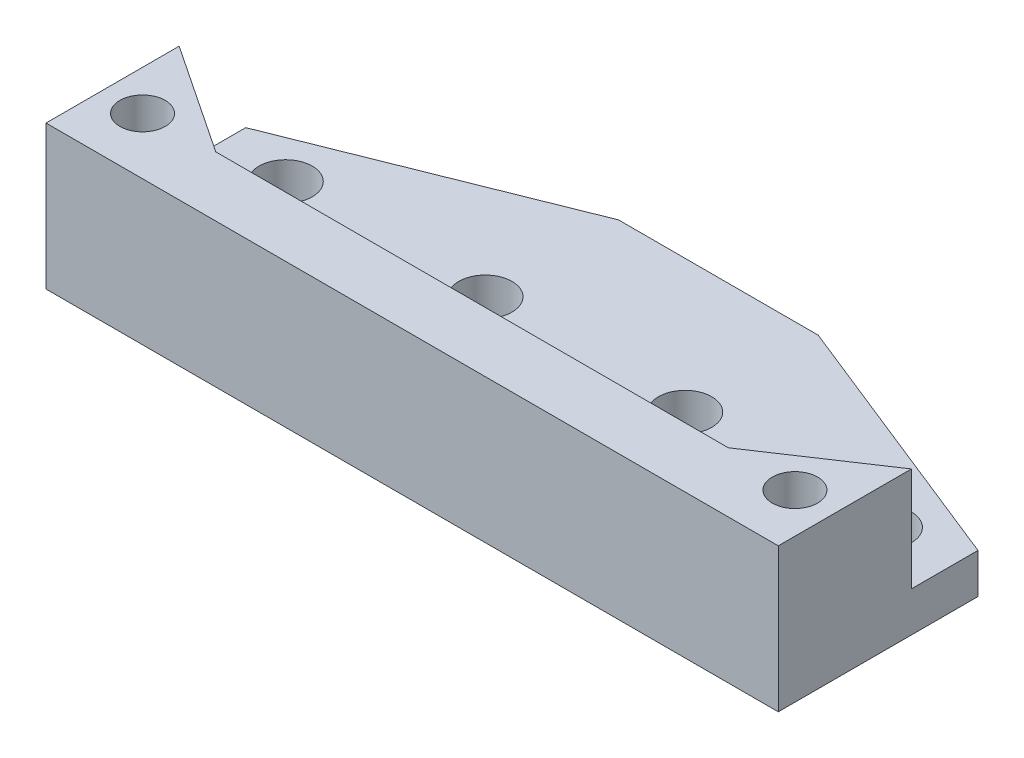
ISO-10303-21;
HEADER;
FILE_DESCRIPTION(('STEP AP214'),'2;1');
FILE_NAME('part.step','',(''),(''),'','','');
FILE_SCHEMA(('AUTOMOTIVE_DESIGN { 1 0 10303 214 1 1 1 1 }'));
ENDSEC;
DATA;
#1=APPLICATION_CONTEXT('core data for automotive mechanical design processes');
#2=APPLICATION_PROTOCOL_DEFINITION('international standard','automotive_design',2000,#1);
#3=PRODUCT_CONTEXT('',#1,'mechanical');
#4=PRODUCT('Part','Part','',(#3));
#5=PRODUCT_RELATED_PRODUCT_CATEGORY('part','',(#4));
#6=PRODUCT_DEFINITION_FORMATION('','',#4);
#7=PRODUCT_DEFINITION_CONTEXT('part definition',#1,'design');
#8=PRODUCT_DEFINITION('design','',#6,#7);
#9=PRODUCT_DEFINITION_SHAPE('','',#8);
#10=(LENGTH_UNIT() NAMED_UNIT(*) SI_UNIT(.MILLI.,.METRE.));
#11=(NAMED_UNIT(*) PLANE_ANGLE_UNIT() SI_UNIT($,.RADIAN.));
#12=(NAMED_UNIT(*) SI_UNIT($,.STERADIAN.) SOLID_ANGLE_UNIT());
#13=UNCERTAINTY_MEASURE_WITH_UNIT(LENGTH_MEASURE(1.E-05),#10,'distance_accuracy_value','');
#14=(GEOMETRIC_REPRESENTATION_CONTEXT(3) GLOBAL_UNCERTAINTY_ASSIGNED_CONTEXT((#13)) GLOBAL_UNIT_ASSIGNED_CONTEXT((#10,
#11,#12)) REPRESENTATION_CONTEXT('',''));
#15=CARTESIAN_POINT('',(0.,0.,0.));
#16=DIRECTION('',(0.,0.,1.));
#17=DIRECTION('',(1.,0.,0.));
#18=AXIS2_PLACEMENT_3D('',#15,#16,#17);
#19=CARTESIAN_POINT('',(0.,3.,0.));
#20=DIRECTION('',(0.,-1.,0.));
#21=DIRECTION('',(0.,0.,-1.));
#22=AXIS2_PLACEMENT_3D('',#19,#20,#21);
#23=PLANE('',#22);
#24=DIRECTION('',(0.,0.,1.));
#25=VECTOR('',#24,1.);
#26=CARTESIAN_POINT('',(0.,3.,0.));
#27=LINE('',#26,#25);
#28=CARTESIAN_POINT('',(0.,3.,-15.));
#29=VERTEX_POINT('',#28);
#30=CARTESIAN_POINT('',(0.,3.,-10.));
#31=VERTEX_POINT('',#30);
#32=EDGE_CURVE('E59',#29,#31,#27,.T.);
#33=ORIENTED_EDGE('',*,*,#32,.T.);
#34=DIRECTION('',(0.832050294337844,0.,0.554700196225229));
#35=VECTOR('',#34,1.);
#36=CARTESIAN_POINT('',(4.61538461538462,3.,-6.92307692307692));
#37=LINE('',#36,#35);
#38=CARTESIAN_POINT('',(8.25000000000001,3.,-4.49999999999999));
#39=VERTEX_POINT('',#38);
#40=EDGE_CURVE('E54',#31,#39,#37,.T.);
#41=ORIENTED_EDGE('',*,*,#40,.T.);
#42=DIRECTION('',(-1.,0.,0.));
#43=VECTOR('',#42,1.);
#44=CARTESIAN_POINT('',(0.,3.,-4.49999999999999));
#45=LINE('',#44,#43);
#46=CARTESIAN_POINT('',(46.75,3.,-4.50000000000001));
#47=VERTEX_POINT('',#46);
#48=EDGE_CURVE('E137',#47,#39,#45,.T.);
#49=ORIENTED_EDGE('',*,*,#48,.F.);
#50=DIRECTION('',(-0.832050294337844,0.,0.554700196225229));
#51=VECTOR('',#50,1.);
#52=CARTESIAN_POINT('',(12.3076923076923,3.,18.4615384615385));
#53=LINE('',#52,#51);
#54=CARTESIAN_POINT('',(55.,3.,-10.));
#55=VERTEX_POINT('',#54);
#56=EDGE_CURVE('E140',#55,#47,#53,.T.);
#57=ORIENTED_EDGE('',*,*,#56,.F.);
#58=DIRECTION('',(0.,0.,-1.));
#59=VECTOR('',#58,1.);
#60=CARTESIAN_POINT('',(55.,3.,-15.));
#61=LINE('',#60,#59);
#62=CARTESIAN_POINT('',(55.,3.,-15.));
#63=VERTEX_POINT('',#62);
#64=EDGE_CURVE('E187',#55,#63,#61,.T.);
#65=ORIENTED_EDGE('',*,*,#64,.T.);
#66=DIRECTION('',(-0.928476690885259,0.,-0.371390676354104));
#67=VECTOR('',#66,1.);
#68=CARTESIAN_POINT('',(35.,3.,-23.));
#69=LINE('',#68,#67);
#70=CARTESIAN_POINT('',(35.,3.,-23.));
#71=VERTEX_POINT('',#70);
#72=EDGE_CURVE('E189',#63,#71,#69,.T.);
#73=ORIENTED_EDGE('',*,*,#72,.T.);
#74=DIRECTION('',(-1.,0.,0.));
#75=VECTOR('',#74,1.);
#76=CARTESIAN_POINT('',(20.,3.,-23.));
#77=LINE('',#76,#75);
#78=CARTESIAN_POINT('',(20.,3.,-23.));
#79=VERTEX_POINT('',#78);
#80=EDGE_CURVE('E192',#71,#79,#77,.T.);
#81=ORIENTED_EDGE('',*,*,#80,.T.);
#82=DIRECTION('',(-0.928476690885259,0.,0.371390676354104));
#83=VECTOR('',#82,1.);
#84=CARTESIAN_POINT('',(0.,3.,-15.));
#85=LINE('',#84,#83);
#86=EDGE_CURVE('E194',#79,#29,#85,.T.);
#87=ORIENTED_EDGE('',*,*,#86,.T.);
#88=EDGE_LOOP('',(#33,#41,#49,#57,#65,#73,#81,#87));
#89=FACE_BOUND('',#88,.T.);
#90=CARTESIAN_POINT('',(5.,3.,-13.));
#91=DIRECTION('',(0.,1.,0.));
#92=DIRECTION('',(0.,0.,1.));
#93=AXIS2_PLACEMENT_3D('',#90,#91,#92);
#94=CIRCLE('',#93,2.);
#95=CARTESIAN_POINT('',(5.,3.,-11.));
#96=VERTEX_POINT('',#95);
#97=EDGE_CURVE('E181',#96,#96,#94,.T.);
#98=ORIENTED_EDGE('',*,*,#97,.F.);
#99=EDGE_LOOP('',(#98));
#100=FACE_BOUND('',#99,.T.);
#101=CARTESIAN_POINT('',(20.,3.,-13.));
#102=DIRECTION('',(0.,1.,0.));
#103=DIRECTION('',(0.,0.,1.));
#104=AXIS2_PLACEMENT_3D('',#101,#102,#103);
#105=CIRCLE('',#104,2.);
#106=CARTESIAN_POINT('',(20.,3.,-11.));
#107=VERTEX_POINT('',#106);
#108=EDGE_CURVE('E175',#107,#107,#105,.T.);
#109=ORIENTED_EDGE('',*,*,#108,.F.);
#110=EDGE_LOOP('',(#109));
#111=FACE_BOUND('',#110,.T.);
#112=CARTESIAN_POINT('',(35.,3.,-13.));
#113=DIRECTION('',(0.,1.,0.));
#114=DIRECTION('',(0.,0.,1.));
#115=AXIS2_PLACEMENT_3D('',#112,#113,#114);
#116=CIRCLE('',#115,2.);
#117=CARTESIAN_POINT('',(35.,3.,-11.));
#118=VERTEX_POINT('',#117);
#119=EDGE_CURVE('E169',#118,#118,#116,.T.);
#120=ORIENTED_EDGE('',*,*,#119,.F.);
#121=EDGE_LOOP('',(#120));
#122=FACE_BOUND('',#121,.T.);
#123=CARTESIAN_POINT('',(50.,3.,-13.));
#124=DIRECTION('',(0.,1.,0.));
#125=DIRECTION('',(0.,0.,1.));
#126=AXIS2_PLACEMENT_3D('',#123,#124,#125);
#127=CIRCLE('',#126,2.);
#128=CARTESIAN_POINT('',(50.,3.,-11.));
#129=VERTEX_POINT('',#128);
#130=EDGE_CURVE('E163',#129,#129,#127,.T.);
#131=ORIENTED_EDGE('',*,*,#130,.F.);
#132=EDGE_LOOP('',(#131));
#133=FACE_BOUND('',#132,.T.);
#134=ADVANCED_FACE('F39',(#89,#100,#111,#122,#133),#23,.F.);
#135=CARTESIAN_POINT('',(0.,0.,0.));
#136=DIRECTION('',(0.,-1.,0.));
#137=DIRECTION('',(0.,0.,-1.));
#138=AXIS2_PLACEMENT_3D('',#135,#136,#137);
#139=PLANE('',#138);
#140=CARTESIAN_POINT('',(3.,0.,-4.25));
#141=DIRECTION('',(0.,1.,0.));
#142=DIRECTION('',(0.,0.,1.));
#143=AXIS2_PLACEMENT_3D('',#140,#141,#142);
#144=CIRCLE('',#143,1.7);
#145=CARTESIAN_POINT('',(3.,0.,-2.55));
#146=VERTEX_POINT('',#145);
#147=EDGE_CURVE('E154',#146,#146,#144,.T.);
#148=ORIENTED_EDGE('',*,*,#147,.T.);
#149=EDGE_LOOP('',(#148));
#150=FACE_BOUND('',#149,.T.);
#151=CARTESIAN_POINT('',(52.,0.,-4.25));
#152=DIRECTION('',(0.,1.,0.));
#153=DIRECTION('',(0.,0.,1.));
#154=AXIS2_PLACEMENT_3D('',#151,#152,#153);
#155=CIRCLE('',#154,1.7);
#156=CARTESIAN_POINT('',(52.,0.,-2.55));
#157=VERTEX_POINT('',#156);
#158=EDGE_CURVE('E143',#157,#157,#155,.T.);
#159=ORIENTED_EDGE('',*,*,#158,.T.);
#160=EDGE_LOOP('',(#159));
#161=FACE_BOUND('',#160,.T.);
#162=CARTESIAN_POINT('',(35.,0.,-13.));
#163=DIRECTION('',(0.,1.,0.));
#164=DIRECTION('',(0.,0.,1.));
#165=AXIS2_PLACEMENT_3D('',#162,#163,#164);
#166=CIRCLE('',#165,2.);
#167=CARTESIAN_POINT('',(35.,0.,-11.));
#168=VERTEX_POINT('',#167);
#169=EDGE_CURVE('E166',#168,#168,#166,.T.);
#170=ORIENTED_EDGE('',*,*,#169,.T.);
#171=EDGE_LOOP('',(#170));
#172=FACE_BOUND('',#171,.T.);
#173=CARTESIAN_POINT('',(5.,0.,-13.));
#174=DIRECTION('',(0.,1.,0.));
#175=DIRECTION('',(0.,0.,1.));
#176=AXIS2_PLACEMENT_3D('',#173,#174,#175);
#177=CIRCLE('',#176,2.);
#178=CARTESIAN_POINT('',(5.,0.,-11.));
#179=VERTEX_POINT('',#178);
#180=EDGE_CURVE('E178',#179,#179,#177,.T.);
#181=ORIENTED_EDGE('',*,*,#180,.T.);
#182=EDGE_LOOP('',(#181));
#183=FACE_BOUND('',#182,.T.);
#184=DIRECTION('',(1.,0.,0.));
#185=VECTOR('',#184,1.);
#186=CARTESIAN_POINT('',(55.,0.,0.));
#187=LINE('',#186,#185);
#188=CARTESIAN_POINT('',(0.,0.,0.));
#189=VERTEX_POINT('',#188);
#190=CARTESIAN_POINT('',(55.,0.,0.));
#191=VERTEX_POINT('',#190);
#192=EDGE_CURVE('E184',#189,#191,#187,.T.);
#193=ORIENTED_EDGE('',*,*,#192,.F.);
#194=DIRECTION('',(0.,0.,1.));
#195=VECTOR('',#194,1.);
#196=CARTESIAN_POINT('',(0.,0.,0.));
#197=LINE('',#196,#195);
#198=CARTESIAN_POINT('',(0.,0.,-15.));
#199=VERTEX_POINT('',#198);
#200=EDGE_CURVE('E190',#199,#189,#197,.T.);
#201=ORIENTED_EDGE('',*,*,#200,.F.);
#202=DIRECTION('',(-0.928476690885259,0.,0.371390676354104));
#203=VECTOR('',#202,1.);
#204=CARTESIAN_POINT('',(0.,0.,-15.));
#205=LINE('',#204,#203);
#206=CARTESIAN_POINT('',(20.,0.,-23.));
#207=VERTEX_POINT('',#206);
#208=EDGE_CURVE('E205',#207,#199,#205,.T.);
#209=ORIENTED_EDGE('',*,*,#208,.F.);
#210=DIRECTION('',(-1.,0.,0.));
#211=VECTOR('',#210,1.);
#212=CARTESIAN_POINT('',(20.,0.,-23.));
#213=LINE('',#212,#211);
#214=CARTESIAN_POINT('',(35.,0.,-23.));
#215=VERTEX_POINT('',#214);
#216=EDGE_CURVE('E203',#215,#207,#213,.T.);
#217=ORIENTED_EDGE('',*,*,#216,.F.);
#218=DIRECTION('',(-0.928476690885259,0.,-0.371390676354104));
#219=VECTOR('',#218,1.);
#220=CARTESIAN_POINT('',(35.,0.,-23.));
#221=LINE('',#220,#219);
#222=CARTESIAN_POINT('',(55.,0.,-15.));
#223=VERTEX_POINT('',#222);
#224=EDGE_CURVE('E201',#223,#215,#221,.T.);
#225=ORIENTED_EDGE('',*,*,#224,.F.);
#226=DIRECTION('',(0.,0.,-1.));
#227=VECTOR('',#226,1.);
#228=CARTESIAN_POINT('',(55.,0.,-15.));
#229=LINE('',#228,#227);
#230=EDGE_CURVE('E199',#191,#223,#229,.T.);
#231=ORIENTED_EDGE('',*,*,#230,.F.);
#232=EDGE_LOOP('',(#193,#201,#209,#217,#225,#231));
#233=FACE_BOUND('',#232,.T.);
#234=CARTESIAN_POINT('',(20.,0.,-13.));
#235=DIRECTION('',(0.,1.,0.));
#236=DIRECTION('',(0.,0.,1.));
#237=AXIS2_PLACEMENT_3D('',#234,#235,#236);
#238=CIRCLE('',#237,2.);
#239=CARTESIAN_POINT('',(20.,0.,-11.));
#240=VERTEX_POINT('',#239);
#241=EDGE_CURVE('E172',#240,#240,#238,.T.);
#242=ORIENTED_EDGE('',*,*,#241,.T.);
#243=EDGE_LOOP('',(#242));
#244=FACE_BOUND('',#243,.T.);
#245=CARTESIAN_POINT('',(50.,0.,-13.));
#246=DIRECTION('',(0.,1.,0.));
#247=DIRECTION('',(0.,0.,1.));
#248=AXIS2_PLACEMENT_3D('',#245,#246,#247);
#249=CIRCLE('',#248,2.);
#250=CARTESIAN_POINT('',(50.,0.,-11.));
#251=VERTEX_POINT('',#250);
#252=EDGE_CURVE('E120',#251,#251,#249,.T.);
#253=ORIENTED_EDGE('',*,*,#252,.T.);
#254=EDGE_LOOP('',(#253));
#255=FACE_BOUND('',#254,.T.);
#256=ADVANCED_FACE('F229',(#150,#161,#172,#183,#233,#244,#255),#139,.T.);
#257=CARTESIAN_POINT('',(55.,3.,0.));
#258=DIRECTION('',(0.,0.,-1.));
#259=DIRECTION('',(-1.,0.,0.));
#260=AXIS2_PLACEMENT_3D('',#257,#258,#259);
#261=PLANE('',#260);
#262=ORIENTED_EDGE('',*,*,#192,.T.);
#263=DIRECTION('',(0.,-1.,0.));
#264=VECTOR('',#263,1.);
#265=CARTESIAN_POINT('',(55.,3.,0.));
#266=LINE('',#265,#264);
#267=CARTESIAN_POINT('',(55.,10.8,0.));
#268=VERTEX_POINT('',#267);
#269=EDGE_CURVE('E11',#268,#191,#266,.T.);
#270=ORIENTED_EDGE('',*,*,#269,.F.);
#271=DIRECTION('',(1.,0.,0.));
#272=VECTOR('',#271,1.);
#273=CARTESIAN_POINT('',(0.,10.8,0.));
#274=LINE('',#273,#272);
#275=CARTESIAN_POINT('',(0.,10.8,0.));
#276=VERTEX_POINT('',#275);
#277=EDGE_CURVE('E131',#276,#268,#274,.T.);
#278=ORIENTED_EDGE('',*,*,#277,.F.);
#279=DIRECTION('',(0.,-1.,0.));
#280=VECTOR('',#279,1.);
#281=CARTESIAN_POINT('',(0.,3.,0.));
#282=LINE('',#281,#280);
#283=EDGE_CURVE('E127',#276,#189,#282,.T.);
#284=ORIENTED_EDGE('',*,*,#283,.T.);
#285=EDGE_LOOP('',(#262,#270,#278,#284));
#286=FACE_BOUND('',#285,.T.);
#287=ADVANCED_FACE('F41',(#286),#261,.F.);
#288=CARTESIAN_POINT('',(55.,3.,-15.));
#289=DIRECTION('',(-1.,0.,0.));
#290=DIRECTION('',(0.,0.,1.));
#291=AXIS2_PLACEMENT_3D('',#288,#289,#290);
#292=PLANE('',#291);
#293=ORIENTED_EDGE('',*,*,#230,.T.);
#294=DIRECTION('',(0.,-1.,0.));
#295=VECTOR('',#294,1.);
#296=CARTESIAN_POINT('',(55.,3.,-15.));
#297=LINE('',#296,#295);
#298=EDGE_CURVE('E47',#63,#223,#297,.T.);
#299=ORIENTED_EDGE('',*,*,#298,.F.);
#300=ORIENTED_EDGE('',*,*,#64,.F.);
#301=DIRECTION('',(0.,-1.,0.));
#302=VECTOR('',#301,1.);
#303=CARTESIAN_POINT('',(55.,10.8,-10.));
#304=LINE('',#303,#302);
#305=CARTESIAN_POINT('',(55.,10.8,-10.));
#306=VERTEX_POINT('',#305);
#307=EDGE_CURVE('E121',#306,#55,#304,.T.);
#308=ORIENTED_EDGE('',*,*,#307,.F.);
#309=DIRECTION('',(0.,0.,-1.));
#310=VECTOR('',#309,1.);
#311=CARTESIAN_POINT('',(55.,10.8,0.));
#312=LINE('',#311,#310);
#313=EDGE_CURVE('E147',#268,#306,#312,.T.);
#314=ORIENTED_EDGE('',*,*,#313,.F.);
#315=ORIENTED_EDGE('',*,*,#269,.T.);
#316=EDGE_LOOP('',(#293,#299,#300,#308,#314,#315));
#317=FACE_BOUND('',#316,.T.);
#318=ADVANCED_FACE('F243',(#317),#292,.F.);
#319=CARTESIAN_POINT('',(35.,3.,-23.));
#320=DIRECTION('',(-0.371390676354104,0.,0.928476690885259));
#321=DIRECTION('',(0.928476690885259,0.,0.371390676354104));
#322=AXIS2_PLACEMENT_3D('',#319,#320,#321);
#323=PLANE('',#322);
#324=ORIENTED_EDGE('',*,*,#224,.T.);
#325=DIRECTION('',(0.,-1.,0.));
#326=VECTOR('',#325,1.);
#327=CARTESIAN_POINT('',(35.,3.,-23.));
#328=LINE('',#327,#326);
#329=EDGE_CURVE('E215',#71,#215,#328,.T.);
#330=ORIENTED_EDGE('',*,*,#329,.F.);
#331=ORIENTED_EDGE('',*,*,#72,.F.);
#332=ORIENTED_EDGE('',*,*,#298,.T.);
#333=EDGE_LOOP('',(#324,#330,#331,#332));
#334=FACE_BOUND('',#333,.T.);
#335=ADVANCED_FACE('F222',(#334),#323,.F.);
#336=CARTESIAN_POINT('',(20.,3.,-23.));
#337=DIRECTION('',(0.,0.,1.));
#338=DIRECTION('',(1.,0.,0.));
#339=AXIS2_PLACEMENT_3D('',#336,#337,#338);
#340=PLANE('',#339);
#341=ORIENTED_EDGE('',*,*,#216,.T.);
#342=DIRECTION('',(0.,-1.,0.));
#343=VECTOR('',#342,1.);
#344=CARTESIAN_POINT('',(20.,3.,-23.));
#345=LINE('',#344,#343);
#346=EDGE_CURVE('E212',#79,#207,#345,.T.);
#347=ORIENTED_EDGE('',*,*,#346,.F.);
#348=ORIENTED_EDGE('',*,*,#80,.F.);
#349=ORIENTED_EDGE('',*,*,#329,.T.);
#350=EDGE_LOOP('',(#341,#347,#348,#349));
#351=FACE_BOUND('',#350,.T.);
#352=ADVANCED_FACE('F235',(#351),#340,.F.);
#353=CARTESIAN_POINT('',(0.,3.,-15.));
#354=DIRECTION('',(0.371390676354104,0.,0.928476690885259));
#355=DIRECTION('',(0.928476690885259,0.,-0.371390676354104));
#356=AXIS2_PLACEMENT_3D('',#353,#354,#355);
#357=PLANE('',#356);
#358=ORIENTED_EDGE('',*,*,#208,.T.);
#359=DIRECTION('',(0.,-1.,0.));
#360=VECTOR('',#359,1.);
#361=CARTESIAN_POINT('',(0.,3.,-15.));
#362=LINE('',#361,#360);
#363=EDGE_CURVE('E209',#29,#199,#362,.T.);
#364=ORIENTED_EDGE('',*,*,#363,.F.);
#365=ORIENTED_EDGE('',*,*,#86,.F.);
#366=ORIENTED_EDGE('',*,*,#346,.T.);
#367=EDGE_LOOP('',(#358,#364,#365,#366));
#368=FACE_BOUND('',#367,.T.);
#369=ADVANCED_FACE('F239',(#368),#357,.F.);
#370=CARTESIAN_POINT('',(0.,3.,0.));
#371=DIRECTION('',(1.,0.,0.));
#372=DIRECTION('',(0.,0.,-1.));
#373=AXIS2_PLACEMENT_3D('',#370,#371,#372);
#374=PLANE('',#373);
#375=ORIENTED_EDGE('',*,*,#200,.T.);
#376=ORIENTED_EDGE('',*,*,#283,.F.);
#377=DIRECTION('',(0.,0.,1.));
#378=VECTOR('',#377,1.);
#379=CARTESIAN_POINT('',(0.,10.8,0.));
#380=LINE('',#379,#378);
#381=CARTESIAN_POINT('',(0.,10.8,-10.));
#382=VERTEX_POINT('',#381);
#383=EDGE_CURVE('E124',#382,#276,#380,.T.);
#384=ORIENTED_EDGE('',*,*,#383,.F.);
#385=DIRECTION('',(0.,-1.,0.));
#386=VECTOR('',#385,1.);
#387=CARTESIAN_POINT('',(0.,10.8,-10.));
#388=LINE('',#387,#386);
#389=EDGE_CURVE('E114',#382,#31,#388,.T.);
#390=ORIENTED_EDGE('',*,*,#389,.T.);
#391=ORIENTED_EDGE('',*,*,#32,.F.);
#392=ORIENTED_EDGE('',*,*,#363,.T.);
#393=EDGE_LOOP('',(#375,#376,#384,#390,#391,#392));
#394=FACE_BOUND('',#393,.T.);
#395=ADVANCED_FACE('F125',(#394),#374,.F.);
#396=CARTESIAN_POINT('',(5.,3.,-13.));
#397=DIRECTION('',(0.,-1.,0.));
#398=DIRECTION('',(0.,0.,-1.));
#399=AXIS2_PLACEMENT_3D('',#396,#397,#398);
#400=CYLINDRICAL_SURFACE('',#399,2.);
#401=ORIENTED_EDGE('',*,*,#97,.T.);
#402=EDGE_LOOP('',(#401));
#403=FACE_BOUND('',#402,.T.);
#404=ORIENTED_EDGE('',*,*,#180,.F.);
#405=EDGE_LOOP('',(#404));
#406=FACE_BOUND('',#405,.T.);
#407=ADVANCED_FACE('F264',(#403,#406),#400,.F.);
#408=CARTESIAN_POINT('',(20.,3.,-13.));
#409=DIRECTION('',(0.,-1.,0.));
#410=DIRECTION('',(0.,0.,-1.));
#411=AXIS2_PLACEMENT_3D('',#408,#409,#410);
#412=CYLINDRICAL_SURFACE('',#411,2.);
#413=ORIENTED_EDGE('',*,*,#108,.T.);
#414=EDGE_LOOP('',(#413));
#415=FACE_BOUND('',#414,.T.);
#416=ORIENTED_EDGE('',*,*,#241,.F.);
#417=EDGE_LOOP('',(#416));
#418=FACE_BOUND('',#417,.T.);
#419=ADVANCED_FACE('F293',(#415,#418),#412,.F.);
#420=CARTESIAN_POINT('',(35.,3.,-13.));
#421=DIRECTION('',(0.,-1.,0.));
#422=DIRECTION('',(0.,0.,-1.));
#423=AXIS2_PLACEMENT_3D('',#420,#421,#422);
#424=CYLINDRICAL_SURFACE('',#423,2.);
#425=ORIENTED_EDGE('',*,*,#119,.T.);
#426=EDGE_LOOP('',(#425));
#427=FACE_BOUND('',#426,.T.);
#428=ORIENTED_EDGE('',*,*,#169,.F.);
#429=EDGE_LOOP('',(#428));
#430=FACE_BOUND('',#429,.T.);
#431=ADVANCED_FACE('F300',(#427,#430),#424,.F.);
#432=CARTESIAN_POINT('',(50.,3.,-13.));
#433=DIRECTION('',(0.,-1.,0.));
#434=DIRECTION('',(0.,0.,-1.));
#435=AXIS2_PLACEMENT_3D('',#432,#433,#434);
#436=CYLINDRICAL_SURFACE('',#435,2.);
#437=ORIENTED_EDGE('',*,*,#130,.T.);
#438=EDGE_LOOP('',(#437));
#439=FACE_BOUND('',#438,.T.);
#440=ORIENTED_EDGE('',*,*,#252,.F.);
#441=EDGE_LOOP('',(#440));
#442=FACE_BOUND('',#441,.T.);
#443=ADVANCED_FACE('F306',(#439,#442),#436,.F.);
#444=CARTESIAN_POINT('',(4.61538461538462,10.8,-6.92307692307692));
#445=DIRECTION('',(0.554700196225229,0.,-0.832050294337844));
#446=DIRECTION('',(-0.832050294337844,0.,-0.554700196225229));
#447=AXIS2_PLACEMENT_3D('',#444,#445,#446);
#448=PLANE('',#447);
#449=ORIENTED_EDGE('',*,*,#40,.F.);
#450=ORIENTED_EDGE('',*,*,#389,.F.);
#451=DIRECTION('',(0.832050294337844,0.,0.554700196225229));
#452=VECTOR('',#451,1.);
#453=CARTESIAN_POINT('',(4.61538461538462,10.8,-6.92307692307692));
#454=LINE('',#453,#452);
#455=CARTESIAN_POINT('',(8.25000000000001,10.8,-4.49999999999999));
#456=VERTEX_POINT('',#455);
#457=EDGE_CURVE('E118',#382,#456,#454,.T.);
#458=ORIENTED_EDGE('',*,*,#457,.T.);
#459=DIRECTION('',(0.,-1.,0.));
#460=VECTOR('',#459,1.);
#461=CARTESIAN_POINT('',(8.25000000000001,10.8,-4.49999999999999));
#462=LINE('',#461,#460);
#463=EDGE_CURVE('E152',#456,#39,#462,.T.);
#464=ORIENTED_EDGE('',*,*,#463,.T.);
#465=EDGE_LOOP('',(#449,#450,#458,#464));
#466=FACE_BOUND('',#465,.T.);
#467=ADVANCED_FACE('F116',(#466),#448,.T.);
#468=CARTESIAN_POINT('',(12.3076923076923,10.8,18.4615384615385));
#469=DIRECTION('',(0.554700196225229,0.,0.832050294337844));
#470=DIRECTION('',(0.832050294337844,0.,-0.554700196225229));
#471=AXIS2_PLACEMENT_3D('',#468,#469,#470);
#472=PLANE('',#471);
#473=ORIENTED_EDGE('',*,*,#56,.T.);
#474=DIRECTION('',(0.,-1.,0.));
#475=VECTOR('',#474,1.);
#476=CARTESIAN_POINT('',(46.75,10.8,-4.50000000000001));
#477=LINE('',#476,#475);
#478=CARTESIAN_POINT('',(46.75,10.8,-4.50000000000001));
#479=VERTEX_POINT('',#478);
#480=EDGE_CURVE('E158',#479,#47,#477,.T.);
#481=ORIENTED_EDGE('',*,*,#480,.F.);
#482=DIRECTION('',(-0.832050294337844,0.,0.554700196225229));
#483=VECTOR('',#482,1.);
#484=CARTESIAN_POINT('',(12.3076923076923,10.8,18.4615384615385));
#485=LINE('',#484,#483);
#486=EDGE_CURVE('E149',#306,#479,#485,.T.);
#487=ORIENTED_EDGE('',*,*,#486,.F.);
#488=ORIENTED_EDGE('',*,*,#307,.T.);
#489=EDGE_LOOP('',(#473,#481,#487,#488));
#490=FACE_BOUND('',#489,.T.);
#491=ADVANCED_FACE('F247',(#490),#472,.F.);
#492=CARTESIAN_POINT('',(0.,10.8,-4.49999999999999));
#493=DIRECTION('',(0.,0.,1.));
#494=DIRECTION('',(1.,0.,0.));
#495=AXIS2_PLACEMENT_3D('',#492,#493,#494);
#496=PLANE('',#495);
#497=ORIENTED_EDGE('',*,*,#48,.T.);
#498=ORIENTED_EDGE('',*,*,#463,.F.);
#499=DIRECTION('',(-1.,0.,0.));
#500=VECTOR('',#499,1.);
#501=CARTESIAN_POINT('',(0.,10.8,-4.49999999999999));
#502=LINE('',#501,#500);
#503=EDGE_CURVE('E135',#479,#456,#502,.T.);
#504=ORIENTED_EDGE('',*,*,#503,.F.);
#505=ORIENTED_EDGE('',*,*,#480,.T.);
#506=EDGE_LOOP('',(#497,#498,#504,#505));
#507=FACE_BOUND('',#506,.T.);
#508=ADVANCED_FACE('F377',(#507),#496,.F.);
#509=CARTESIAN_POINT('',(0.,10.8,0.));
#510=DIRECTION('',(0.,1.,0.));
#511=DIRECTION('',(0.,0.,1.));
#512=AXIS2_PLACEMENT_3D('',#509,#510,#511);
#513=PLANE('',#512);
#514=CARTESIAN_POINT('',(3.,10.8,-4.25));
#515=DIRECTION('',(0.,1.,0.));
#516=DIRECTION('',(0.,0.,1.));
#517=AXIS2_PLACEMENT_3D('',#514,#515,#516);
#518=CIRCLE('',#517,1.7);
#519=CARTESIAN_POINT('',(3.,10.8,-2.55));
#520=VERTEX_POINT('',#519);
#521=EDGE_CURVE('E441',#520,#520,#518,.T.);
#522=ORIENTED_EDGE('',*,*,#521,.F.);
#523=EDGE_LOOP('',(#522));
#524=FACE_BOUND('',#523,.T.);
#525=CARTESIAN_POINT('',(52.,10.8,-4.25));
#526=DIRECTION('',(0.,1.,0.));
#527=DIRECTION('',(0.,0.,1.));
#528=AXIS2_PLACEMENT_3D('',#525,#526,#527);
#529=CIRCLE('',#528,1.7);
#530=CARTESIAN_POINT('',(52.,10.8,-2.55));
#531=VERTEX_POINT('',#530);
#532=EDGE_CURVE('E442',#531,#531,#529,.T.);
#533=ORIENTED_EDGE('',*,*,#532,.F.);
#534=EDGE_LOOP('',(#533));
#535=FACE_BOUND('',#534,.T.);
#536=ORIENTED_EDGE('',*,*,#457,.F.);
#537=ORIENTED_EDGE('',*,*,#383,.T.);
#538=ORIENTED_EDGE('',*,*,#277,.T.);
#539=ORIENTED_EDGE('',*,*,#313,.T.);
#540=ORIENTED_EDGE('',*,*,#486,.T.);
#541=ORIENTED_EDGE('',*,*,#503,.T.);
#542=EDGE_LOOP('',(#536,#537,#538,#539,#540,#541));
#543=FACE_BOUND('',#542,.T.);
#544=ADVANCED_FACE('F133',(#524,#535,#543),#513,.T.);
#545=CARTESIAN_POINT('',(52.,0.,-4.25));
#546=DIRECTION('',(0.,1.,0.));
#547=DIRECTION('',(0.,0.,1.));
#548=AXIS2_PLACEMENT_3D('',#545,#546,#547);
#549=CYLINDRICAL_SURFACE('',#548,1.7);
#550=CARTESIAN_POINT('',(52.,0.,-2.55));
#551=CARTESIAN_POINT('',(52.,0.1125,-2.55));
#552=CARTESIAN_POINT('',(52.,0.225,-2.55));
#553=CARTESIAN_POINT('',(52.,0.45,-2.55));
#554=CARTESIAN_POINT('',(52.,0.5625,-2.55));
#555=CARTESIAN_POINT('',(52.,0.7875,-2.55));
#556=CARTESIAN_POINT('',(52.,0.9,-2.55));
#557=CARTESIAN_POINT('',(52.,1.125,-2.55));
#558=CARTESIAN_POINT('',(52.,1.2375,-2.55));
#559=CARTESIAN_POINT('',(52.,1.4625,-2.55));
#560=CARTESIAN_POINT('',(52.,1.575,-2.55));
#561=CARTESIAN_POINT('',(52.,1.8,-2.55));
#562=CARTESIAN_POINT('',(52.,1.9125,-2.55));
#563=CARTESIAN_POINT('',(52.,2.1375,-2.55));
#564=CARTESIAN_POINT('',(52.,2.25,-2.55));
#565=CARTESIAN_POINT('',(52.,2.475,-2.55));
#566=CARTESIAN_POINT('',(52.,2.5875,-2.55));
#567=CARTESIAN_POINT('',(52.,2.8125,-2.55));
#568=CARTESIAN_POINT('',(52.,2.925,-2.55));
#569=CARTESIAN_POINT('',(52.,3.15,-2.55));
#570=CARTESIAN_POINT('',(52.,3.2625,-2.55));
#571=CARTESIAN_POINT('',(52.,3.4875,-2.55));
#572=CARTESIAN_POINT('',(52.,3.6,-2.55));
#573=CARTESIAN_POINT('',(52.,3.825,-2.55));
#574=CARTESIAN_POINT('',(52.,3.9375,-2.55));
#575=CARTESIAN_POINT('',(52.,4.1625,-2.55));
#576=CARTESIAN_POINT('',(52.,4.275,-2.55));
#577=CARTESIAN_POINT('',(52.,4.5,-2.55));
#578=CARTESIAN_POINT('',(52.,4.6125,-2.55));
#579=CARTESIAN_POINT('',(52.,4.8375,-2.55));
#580=CARTESIAN_POINT('',(52.,4.95,-2.55));
#581=CARTESIAN_POINT('',(52.,5.175,-2.55));
#582=CARTESIAN_POINT('',(52.,5.2875,-2.55));
#583=CARTESIAN_POINT('',(52.,5.5125,-2.55));
#584=CARTESIAN_POINT('',(52.,5.625,-2.55));
#585=CARTESIAN_POINT('',(52.,5.85,-2.55));
#586=CARTESIAN_POINT('',(52.,5.9625,-2.55));
#587=CARTESIAN_POINT('',(52.,6.1875,-2.55));
#588=CARTESIAN_POINT('',(52.,6.3,-2.55));
#589=CARTESIAN_POINT('',(52.,6.525,-2.55));
#590=CARTESIAN_POINT('',(52.,6.6375,-2.55));
#591=CARTESIAN_POINT('',(52.,6.8625,-2.55));
#592=CARTESIAN_POINT('',(52.,6.975,-2.55));
#593=CARTESIAN_POINT('',(52.,7.2,-2.55));
#594=CARTESIAN_POINT('',(52.,7.3125,-2.55));
#595=CARTESIAN_POINT('',(52.,7.5375,-2.55));
#596=CARTESIAN_POINT('',(52.,7.65,-2.55));
#597=CARTESIAN_POINT('',(52.,7.875,-2.55));
#598=CARTESIAN_POINT('',(52.,7.9875,-2.55));
#599=CARTESIAN_POINT('',(52.,8.2125,-2.55));
#600=CARTESIAN_POINT('',(52.,8.325,-2.55));
#601=CARTESIAN_POINT('',(52.,8.55,-2.55));
#602=CARTESIAN_POINT('',(52.,8.6625,-2.55));
#603=CARTESIAN_POINT('',(52.,8.8875,-2.55));
#604=CARTESIAN_POINT('',(52.,9.,-2.55));
#605=CARTESIAN_POINT('',(52.,9.225,-2.55));
#606=CARTESIAN_POINT('',(52.,9.3375,-2.55));
#607=CARTESIAN_POINT('',(52.,9.5625,-2.55));
#608=CARTESIAN_POINT('',(52.,9.675,-2.55));
#609=CARTESIAN_POINT('',(52.,9.9,-2.55));
#610=CARTESIAN_POINT('',(52.,10.0125,-2.55));
#611=CARTESIAN_POINT('',(52.,10.2375,-2.55));
#612=CARTESIAN_POINT('',(52.,10.35,-2.55));
#613=CARTESIAN_POINT('',(52.,10.575,-2.55));
#614=CARTESIAN_POINT('',(52.,10.6875,-2.55));
#615=CARTESIAN_POINT('',(52.,10.8,-2.55));
#616=B_SPLINE_CURVE_WITH_KNOTS('',3,(#550,#551,#552,#553,#554,#555,#556,#557,#558,#559,#560,
#561,#562,#563,#564,#565,#566,#567,#568,#569,#570,#571,#572,#573,#574,#575,#576,#577,#578,#579,
#580,#581,#582,#583,#584,#585,#586,#587,#588,#589,#590,#591,#592,#593,#594,#595,#596,#597,#598,
#599,#600,#601,#602,#603,#604,#605,#606,#607,#608,#609,#610,#611,#612,#613,#614,#615),
.UNSPECIFIED.,.F.,.F.,(4,2,2,2,2,2,2,2,2,2,2,2,2,2,2,2,2,2,2,2,2,2,2,2,2,2,2,2,2,2,2,2,4),(0.,
0.3375,0.675,1.0125,1.35,1.6875,2.025,2.3625,2.7,3.0375,3.375,3.7125,4.05,4.3875,4.725,5.0625,
5.4,5.7375,6.075,6.4125,6.75,7.0875,7.425,7.7625,8.1,8.4375,8.775,9.1125,9.45,9.7875,10.125,
10.4625,10.8),.UNSPECIFIED.);
#617=EDGE_CURVE('BSEAM396',#157,#531,#616,.T.);
#618=ORIENTED_EDGE('',*,*,#158,.F.);
#619=ORIENTED_EDGE('',*,*,#532,.T.);
#620=ORIENTED_EDGE('',*,*,#617,.T.);
#621=ORIENTED_EDGE('',*,*,#617,.F.);
#622=EDGE_LOOP('',(#618,#620,#619,#621));
#623=FACE_BOUND('',#622,.T.);
#624=ADVANCED_FACE('F396',(#623),#549,.F.);
#625=CARTESIAN_POINT('',(3.,0.,-4.25));
#626=DIRECTION('',(0.,1.,0.));
#627=DIRECTION('',(0.,0.,1.));
#628=AXIS2_PLACEMENT_3D('',#625,#626,#627);
#629=CYLINDRICAL_SURFACE('',#628,1.7);
#630=CARTESIAN_POINT('',(3.,0.,-2.55));
#631=CARTESIAN_POINT('',(3.,0.1125,-2.55));
#632=CARTESIAN_POINT('',(3.,0.225,-2.55));
#633=CARTESIAN_POINT('',(3.,0.45,-2.55));
#634=CARTESIAN_POINT('',(3.,0.5625,-2.55));
#635=CARTESIAN_POINT('',(3.,0.7875,-2.55));
#636=CARTESIAN_POINT('',(3.,0.9,-2.55));
#637=CARTESIAN_POINT('',(3.,1.125,-2.55));
#638=CARTESIAN_POINT('',(3.,1.2375,-2.55));
#639=CARTESIAN_POINT('',(3.,1.4625,-2.55));
#640=CARTESIAN_POINT('',(3.,1.575,-2.55));
#641=CARTESIAN_POINT('',(3.,1.8,-2.55));
#642=CARTESIAN_POINT('',(3.,1.9125,-2.55));
#643=CARTESIAN_POINT('',(3.,2.1375,-2.55));
#644=CARTESIAN_POINT('',(3.,2.25,-2.55));
#645=CARTESIAN_POINT('',(3.,2.475,-2.55));
#646=CARTESIAN_POINT('',(3.,2.5875,-2.55));
#647=CARTESIAN_POINT('',(3.,2.8125,-2.55));
#648=CARTESIAN_POINT('',(3.,2.925,-2.55));
#649=CARTESIAN_POINT('',(3.,3.15,-2.55));
#650=CARTESIAN_POINT('',(3.,3.2625,-2.55));
#651=CARTESIAN_POINT('',(3.,3.4875,-2.55));
#652=CARTESIAN_POINT('',(3.,3.6,-2.55));
#653=CARTESIAN_POINT('',(3.,3.825,-2.55));
#654=CARTESIAN_POINT('',(3.,3.9375,-2.55));
#655=CARTESIAN_POINT('',(3.,4.1625,-2.55));
#656=CARTESIAN_POINT('',(3.,4.275,-2.55));
#657=CARTESIAN_POINT('',(3.,4.5,-2.55));
#658=CARTESIAN_POINT('',(3.,4.6125,-2.55));
#659=CARTESIAN_POINT('',(3.,4.8375,-2.55));
#660=CARTESIAN_POINT('',(3.,4.95,-2.55));
#661=CARTESIAN_POINT('',(3.,5.175,-2.55));
#662=CARTESIAN_POINT('',(3.,5.2875,-2.55));
#663=CARTESIAN_POINT('',(3.,5.5125,-2.55));
#664=CARTESIAN_POINT('',(3.,5.625,-2.55));
#665=CARTESIAN_POINT('',(3.,5.85,-2.55));
#666=CARTESIAN_POINT('',(3.,5.9625,-2.55));
#667=CARTESIAN_POINT('',(3.,6.1875,-2.55));
#668=CARTESIAN_POINT('',(3.,6.3,-2.55));
#669=CARTESIAN_POINT('',(3.,6.525,-2.55));
#670=CARTESIAN_POINT('',(3.,6.6375,-2.55));
#671=CARTESIAN_POINT('',(3.,6.8625,-2.55));
#672=CARTESIAN_POINT('',(3.,6.975,-2.55));
#673=CARTESIAN_POINT('',(3.,7.2,-2.55));
#674=CARTESIAN_POINT('',(3.,7.3125,-2.55));
#675=CARTESIAN_POINT('',(3.,7.5375,-2.55));
#676=CARTESIAN_POINT('',(3.,7.65,-2.55));
#677=CARTESIAN_POINT('',(3.,7.875,-2.55));
#678=CARTESIAN_POINT('',(3.,7.9875,-2.55));
#679=CARTESIAN_POINT('',(3.,8.2125,-2.55));
#680=CARTESIAN_POINT('',(3.,8.325,-2.55));
#681=CARTESIAN_POINT('',(3.,8.55,-2.55));
#682=CARTESIAN_POINT('',(3.,8.6625,-2.55));
#683=CARTESIAN_POINT('',(3.,8.8875,-2.55));
#684=CARTESIAN_POINT('',(3.,9.,-2.55));
#685=CARTESIAN_POINT('',(3.,9.225,-2.55));
#686=CARTESIAN_POINT('',(3.,9.3375,-2.55));
#687=CARTESIAN_POINT('',(3.,9.5625,-2.55));
#688=CARTESIAN_POINT('',(3.,9.675,-2.55));
#689=CARTESIAN_POINT('',(3.,9.9,-2.55));
#690=CARTESIAN_POINT('',(3.,10.0125,-2.55));
#691=CARTESIAN_POINT('',(3.,10.2375,-2.55));
#692=CARTESIAN_POINT('',(3.,10.35,-2.55));
#693=CARTESIAN_POINT('',(3.,10.575,-2.55));
#694=CARTESIAN_POINT('',(3.,10.6875,-2.55));
#695=CARTESIAN_POINT('',(3.,10.8,-2.55));
#696=B_SPLINE_CURVE_WITH_KNOTS('',3,(#630,#631,#632,#633,#634,#635,#636,#637,#638,#639,#640,
#641,#642,#643,#644,#645,#646,#647,#648,#649,#650,#651,#652,#653,#654,#655,#656,#657,#658,#659,
#660,#661,#662,#663,#664,#665,#666,#667,#668,#669,#670,#671,#672,#673,#674,#675,#676,#677,#678,
#679,#680,#681,#682,#683,#684,#685,#686,#687,#688,#689,#690,#691,#692,#693,#694,#695),
.UNSPECIFIED.,.F.,.F.,(4,2,2,2,2,2,2,2,2,2,2,2,2,2,2,2,2,2,2,2,2,2,2,2,2,2,2,2,2,2,2,2,4),(0.,
0.3375,0.675,1.0125,1.35,1.6875,2.025,2.3625,2.7,3.0375,3.375,3.7125,4.05,4.3875,4.725,5.0625,
5.4,5.7375,6.075,6.4125,6.75,7.0875,7.425,7.7625,8.1,8.4375,8.775,9.1125,9.45,9.7875,10.125,
10.4625,10.8),.UNSPECIFIED.);
#697=EDGE_CURVE('BSEAM414',#146,#520,#696,.T.);
#698=ORIENTED_EDGE('',*,*,#147,.F.);
#699=ORIENTED_EDGE('',*,*,#521,.T.);
#700=ORIENTED_EDGE('',*,*,#697,.T.);
#701=ORIENTED_EDGE('',*,*,#697,.F.);
#702=EDGE_LOOP('',(#698,#700,#699,#701));
#703=FACE_BOUND('',#702,.T.);
#704=ADVANCED_FACE('F414',(#703),#629,.F.);
#705=CLOSED_SHELL('',(#134,#256,#287,#318,#335,#352,#369,#395,#407,#419,#431,#443,#467,#491,
#508,#544,#624,#704));
#706=MANIFOLD_SOLID_BREP('B2',#705);
#707=ADVANCED_BREP_SHAPE_REPRESENTATION('',(#18,#706),#14);
#708=SHAPE_DEFINITION_REPRESENTATION(#9,#707);
ENDSEC;
END-ISO-10303-21;
